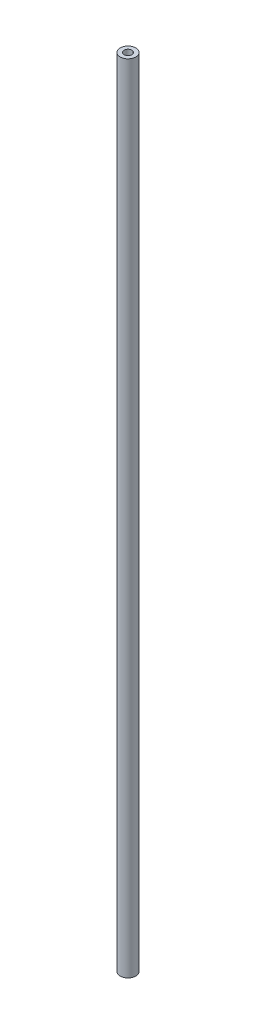
ISO-10303-21;
HEADER;
FILE_DESCRIPTION(('STEP AP214'),'2;1');
FILE_NAME('part.step','',(''),(''),'','','');
FILE_SCHEMA(('AUTOMOTIVE_DESIGN { 1 0 10303 214 1 1 1 1 }'));
ENDSEC;
DATA;
#1=APPLICATION_CONTEXT('core data for automotive mechanical design processes');
#2=APPLICATION_PROTOCOL_DEFINITION('international standard','automotive_design',2000,#1);
#3=PRODUCT_CONTEXT('',#1,'mechanical');
#4=PRODUCT('Part','Part','',(#3));
#5=PRODUCT_RELATED_PRODUCT_CATEGORY('part','',(#4));
#6=PRODUCT_DEFINITION_FORMATION('','',#4);
#7=PRODUCT_DEFINITION_CONTEXT('part definition',#1,'design');
#8=PRODUCT_DEFINITION('design','',#6,#7);
#9=PRODUCT_DEFINITION_SHAPE('','',#8);
#10=(LENGTH_UNIT() NAMED_UNIT(*) SI_UNIT(.MILLI.,.METRE.));
#11=(NAMED_UNIT(*) PLANE_ANGLE_UNIT() SI_UNIT($,.RADIAN.));
#12=(NAMED_UNIT(*) SI_UNIT($,.STERADIAN.) SOLID_ANGLE_UNIT());
#13=UNCERTAINTY_MEASURE_WITH_UNIT(LENGTH_MEASURE(1.E-05),#10,'distance_accuracy_value','');
#14=(GEOMETRIC_REPRESENTATION_CONTEXT(3) GLOBAL_UNCERTAINTY_ASSIGNED_CONTEXT((#13)) GLOBAL_UNIT_ASSIGNED_CONTEXT((#10,
#11,#12)) REPRESENTATION_CONTEXT('',''));
#15=CARTESIAN_POINT('',(0.,0.,0.));
#16=DIRECTION('',(0.,0.,1.));
#17=DIRECTION('',(1.,0.,0.));
#18=AXIS2_PLACEMENT_3D('',#15,#16,#17);
#19=CARTESIAN_POINT('',(0.,303.8,0.));
#20=DIRECTION('',(0.,1.,0.));
#21=DIRECTION('',(0.,0.,1.));
#22=AXIS2_PLACEMENT_3D('',#19,#20,#21);
#23=PLANE('',#22);
#24=CARTESIAN_POINT('',(0.,303.8,0.));
#25=DIRECTION('',(0.,1.,0.));
#26=DIRECTION('',(0.,0.,1.));
#27=AXIS2_PLACEMENT_3D('',#24,#25,#26);
#28=CIRCLE('',#27,3.);
#29=CARTESIAN_POINT('',(0.,303.8,3.));
#30=VERTEX_POINT('',#29);
#31=EDGE_CURVE('E10',#30,#30,#28,.T.);
#32=ORIENTED_EDGE('',*,*,#31,.T.);
#33=EDGE_LOOP('',(#32));
#34=FACE_BOUND('',#33,.T.);
#35=CARTESIAN_POINT('',(0.,303.8,0.));
#36=DIRECTION('',(0.,1.,0.));
#37=DIRECTION('',(0.,0.,1.));
#38=AXIS2_PLACEMENT_3D('',#35,#36,#37);
#39=CIRCLE('',#38,1.5);
#40=CARTESIAN_POINT('',(0.,303.8,1.5));
#41=VERTEX_POINT('',#40);
#42=EDGE_CURVE('E49',#41,#41,#39,.T.);
#43=ORIENTED_EDGE('',*,*,#42,.F.);
#44=EDGE_LOOP('',(#43));
#45=FACE_BOUND('',#44,.T.);
#46=ADVANCED_FACE('F39',(#34,#45),#23,.T.);
#47=CARTESIAN_POINT('',(0.,0.,0.));
#48=DIRECTION('',(0.,1.,0.));
#49=DIRECTION('',(0.,0.,1.));
#50=AXIS2_PLACEMENT_3D('',#47,#48,#49);
#51=PLANE('',#50);
#52=CARTESIAN_POINT('',(0.,0.,0.));
#53=DIRECTION('',(0.,1.,0.));
#54=DIRECTION('',(0.,0.,1.));
#55=AXIS2_PLACEMENT_3D('',#52,#53,#54);
#56=CIRCLE('',#55,3.);
#57=CARTESIAN_POINT('',(0.,0.,3.));
#58=VERTEX_POINT('',#57);
#59=EDGE_CURVE('E43',#58,#58,#56,.T.);
#60=ORIENTED_EDGE('',*,*,#59,.F.);
#61=EDGE_LOOP('',(#60));
#62=FACE_BOUND('',#61,.T.);
#63=CARTESIAN_POINT('',(0.,0.,0.));
#64=DIRECTION('',(0.,1.,0.));
#65=DIRECTION('',(0.,0.,1.));
#66=AXIS2_PLACEMENT_3D('',#63,#64,#65);
#67=CIRCLE('',#66,1.5);
#68=CARTESIAN_POINT('',(0.,0.,1.5));
#69=VERTEX_POINT('',#68);
#70=EDGE_CURVE('E55',#69,#69,#67,.T.);
#71=ORIENTED_EDGE('',*,*,#70,.T.);
#72=EDGE_LOOP('',(#71));
#73=FACE_BOUND('',#72,.T.);
#74=ADVANCED_FACE('F62',(#62,#73),#51,.F.);
#75=CARTESIAN_POINT('',(0.,303.8,0.));
#76=DIRECTION('',(0.,-1.,0.));
#77=DIRECTION('',(0.,0.,-1.));
#78=AXIS2_PLACEMENT_3D('',#75,#76,#77);
#79=CYLINDRICAL_SURFACE('',#78,3.);
#80=ORIENTED_EDGE('',*,*,#31,.F.);
#81=EDGE_LOOP('',(#80));
#82=FACE_BOUND('',#81,.T.);
#83=ORIENTED_EDGE('',*,*,#59,.T.);
#84=EDGE_LOOP('',(#83));
#85=FACE_BOUND('',#84,.T.);
#86=ADVANCED_FACE('F41',(#82,#85),#79,.T.);
#87=CARTESIAN_POINT('',(0.,303.8,0.));
#88=DIRECTION('',(0.,-1.,0.));
#89=DIRECTION('',(0.,0.,-1.));
#90=AXIS2_PLACEMENT_3D('',#87,#88,#89);
#91=CYLINDRICAL_SURFACE('',#90,1.5);
#92=ORIENTED_EDGE('',*,*,#42,.T.);
#93=EDGE_LOOP('',(#92));
#94=FACE_BOUND('',#93,.T.);
#95=ORIENTED_EDGE('',*,*,#70,.F.);
#96=EDGE_LOOP('',(#95));
#97=FACE_BOUND('',#96,.T.);
#98=ADVANCED_FACE('F59',(#94,#97),#91,.F.);
#99=CLOSED_SHELL('',(#46,#74,#86,#98));
#100=MANIFOLD_SOLID_BREP('B2',#99);
#101=ADVANCED_BREP_SHAPE_REPRESENTATION('',(#18,#100),#14);
#102=SHAPE_DEFINITION_REPRESENTATION(#9,#101);
ENDSEC;
END-ISO-10303-21;
